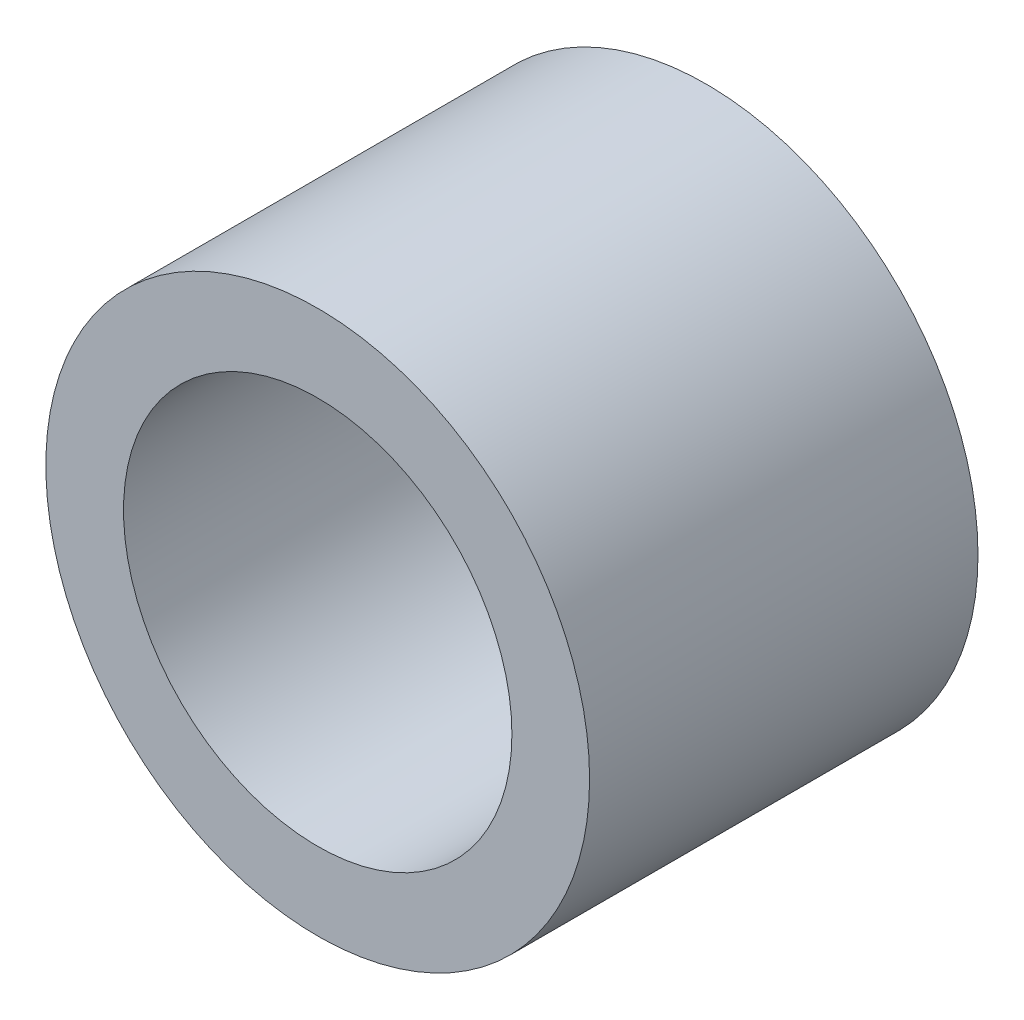
ISO-10303-21;
HEADER;
FILE_DESCRIPTION(('STEP AP214'),'2;1');
FILE_NAME('part.step','',(''),(''),'','','');
FILE_SCHEMA(('AUTOMOTIVE_DESIGN { 1 0 10303 214 1 1 1 1 }'));
ENDSEC;
DATA;
#1=APPLICATION_CONTEXT('core data for automotive mechanical design processes');
#2=APPLICATION_PROTOCOL_DEFINITION('international standard','automotive_design',2000,#1);
#3=PRODUCT_CONTEXT('',#1,'mechanical');
#4=PRODUCT('Part','Part','',(#3));
#5=PRODUCT_RELATED_PRODUCT_CATEGORY('part','',(#4));
#6=PRODUCT_DEFINITION_FORMATION('','',#4);
#7=PRODUCT_DEFINITION_CONTEXT('part definition',#1,'design');
#8=PRODUCT_DEFINITION('design','',#6,#7);
#9=PRODUCT_DEFINITION_SHAPE('','',#8);
#10=(LENGTH_UNIT() NAMED_UNIT(*) SI_UNIT(.MILLI.,.METRE.));
#11=(NAMED_UNIT(*) PLANE_ANGLE_UNIT() SI_UNIT($,.RADIAN.));
#12=(NAMED_UNIT(*) SI_UNIT($,.STERADIAN.) SOLID_ANGLE_UNIT());
#13=UNCERTAINTY_MEASURE_WITH_UNIT(LENGTH_MEASURE(1.E-05),#10,'distance_accuracy_value','');
#14=(GEOMETRIC_REPRESENTATION_CONTEXT(3) GLOBAL_UNCERTAINTY_ASSIGNED_CONTEXT((#13)) GLOBAL_UNIT_ASSIGNED_CONTEXT((#10,
#11,#12)) REPRESENTATION_CONTEXT('',''));
#15=CARTESIAN_POINT('',(0.,0.,0.));
#16=DIRECTION('',(0.,0.,1.));
#17=DIRECTION('',(1.,0.,0.));
#18=AXIS2_PLACEMENT_3D('',#15,#16,#17);
#19=CARTESIAN_POINT('',(80.4033279773208,45.6476090003614,9.5));
#20=DIRECTION('',(0.,0.,1.));
#21=DIRECTION('',(1.,0.,0.));
#22=AXIS2_PLACEMENT_3D('',#19,#20,#21);
#23=PLANE('',#22);
#24=CARTESIAN_POINT('',(80.4033279773208,45.6476090003614,9.5));
#25=DIRECTION('',(0.,0.,1.));
#26=DIRECTION('',(1.,0.,0.));
#27=AXIS2_PLACEMENT_3D('',#24,#25,#26);
#28=CIRCLE('',#27,7.);
#29=CARTESIAN_POINT('',(87.4033279773208,45.6476090003614,9.5));
#30=VERTEX_POINT('',#29);
#31=EDGE_CURVE('E10',#30,#30,#28,.T.);
#32=ORIENTED_EDGE('',*,*,#31,.F.);
#33=EDGE_LOOP('',(#32));
#34=FACE_BOUND('',#33,.T.);
#35=CARTESIAN_POINT('',(80.4033279773208,45.6476090003614,9.5));
#36=DIRECTION('',(0.,0.,1.));
#37=DIRECTION('',(1.,0.,0.));
#38=AXIS2_PLACEMENT_3D('',#35,#36,#37);
#39=CIRCLE('',#38,5.);
#40=CARTESIAN_POINT('',(85.4033279773208,45.6476090003614,9.5));
#41=VERTEX_POINT('',#40);
#42=EDGE_CURVE('E43',#41,#41,#39,.T.);
#43=ORIENTED_EDGE('',*,*,#42,.T.);
#44=EDGE_LOOP('',(#43));
#45=FACE_BOUND('',#44,.T.);
#46=ADVANCED_FACE('F36',(#34,#45),#23,.F.);
#47=CARTESIAN_POINT('',(80.4033279773208,45.6476090003614,14.5));
#48=DIRECTION('',(0.,0.,-1.));
#49=DIRECTION('',(-1.,0.,0.));
#50=AXIS2_PLACEMENT_3D('',#47,#48,#49);
#51=CYLINDRICAL_SURFACE('',#50,7.);
#52=ORIENTED_EDGE('',*,*,#31,.T.);
#53=EDGE_LOOP('',(#52));
#54=FACE_BOUND('',#53,.T.);
#55=CARTESIAN_POINT('',(80.4033279773208,45.6476090003614,19.5));
#56=DIRECTION('',(0.,0.,1.));
#57=DIRECTION('',(1.,0.,0.));
#58=AXIS2_PLACEMENT_3D('',#55,#56,#57);
#59=CIRCLE('',#58,7.);
#60=CARTESIAN_POINT('',(87.4033279773208,45.6476090003614,19.5));
#61=VERTEX_POINT('',#60);
#62=EDGE_CURVE('E47',#61,#61,#59,.T.);
#63=ORIENTED_EDGE('',*,*,#62,.F.);
#64=EDGE_LOOP('',(#63));
#65=FACE_BOUND('',#64,.T.);
#66=ADVANCED_FACE('F38',(#54,#65),#51,.T.);
#67=CARTESIAN_POINT('',(80.4033279773208,45.6476090003614,14.5));
#68=DIRECTION('',(0.,0.,-1.));
#69=DIRECTION('',(-1.,0.,0.));
#70=AXIS2_PLACEMENT_3D('',#67,#68,#69);
#71=CYLINDRICAL_SURFACE('',#70,5.);
#72=ORIENTED_EDGE('',*,*,#42,.F.);
#73=EDGE_LOOP('',(#72));
#74=FACE_BOUND('',#73,.T.);
#75=CARTESIAN_POINT('',(80.4033279773208,45.6476090003614,19.5));
#76=DIRECTION('',(0.,0.,1.));
#77=DIRECTION('',(1.,0.,0.));
#78=AXIS2_PLACEMENT_3D('',#75,#76,#77);
#79=CIRCLE('',#78,5.);
#80=CARTESIAN_POINT('',(85.4033279773208,45.6476090003614,19.5));
#81=VERTEX_POINT('',#80);
#82=EDGE_CURVE('E51',#81,#81,#79,.T.);
#83=ORIENTED_EDGE('',*,*,#82,.T.);
#84=EDGE_LOOP('',(#83));
#85=FACE_BOUND('',#84,.T.);
#86=ADVANCED_FACE('F57',(#74,#85),#71,.F.);
#87=CARTESIAN_POINT('',(80.4033279773208,45.6476090003614,19.5));
#88=DIRECTION('',(0.,0.,1.));
#89=DIRECTION('',(1.,0.,0.));
#90=AXIS2_PLACEMENT_3D('',#87,#88,#89);
#91=PLANE('',#90);
#92=ORIENTED_EDGE('',*,*,#62,.T.);
#93=EDGE_LOOP('',(#92));
#94=FACE_BOUND('',#93,.T.);
#95=ORIENTED_EDGE('',*,*,#82,.F.);
#96=EDGE_LOOP('',(#95));
#97=FACE_BOUND('',#96,.T.);
#98=ADVANCED_FACE('F59',(#94,#97),#91,.T.);
#99=CLOSED_SHELL('',(#46,#66,#86,#98));
#100=MANIFOLD_SOLID_BREP('B2',#99);
#101=ADVANCED_BREP_SHAPE_REPRESENTATION('',(#18,#100),#14);
#102=SHAPE_DEFINITION_REPRESENTATION(#9,#101);
ENDSEC;
END-ISO-10303-21;
